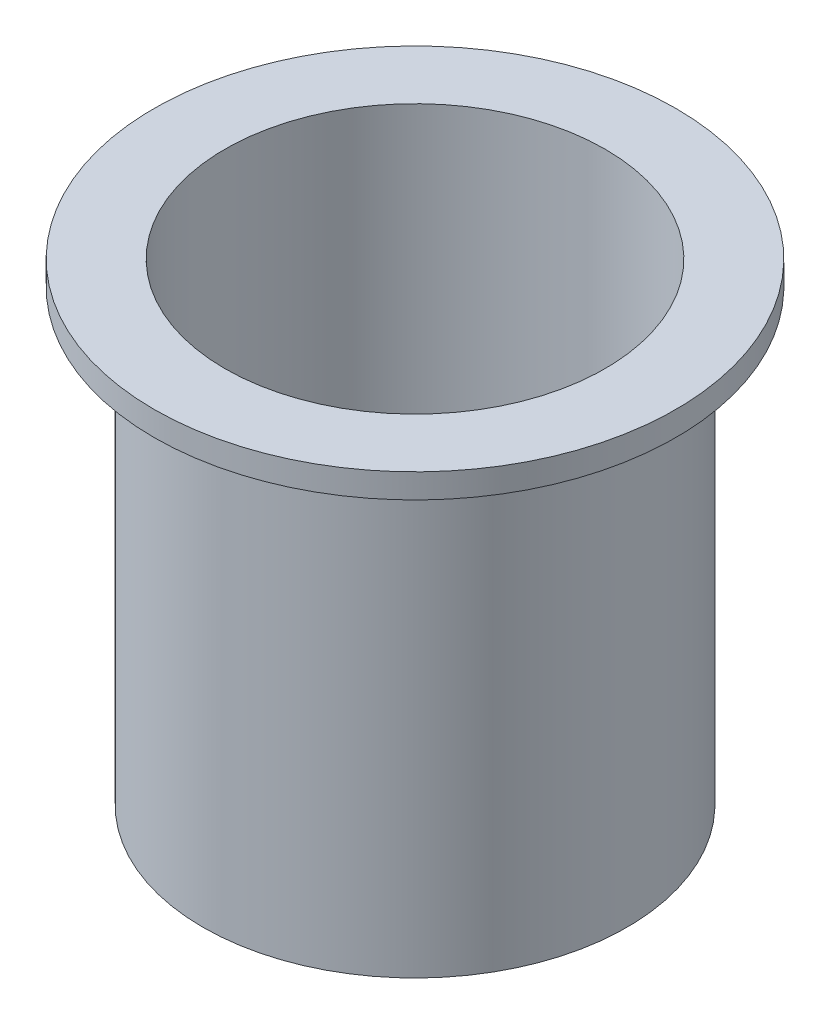
ISO-10303-21;
HEADER;
FILE_DESCRIPTION(('STEP AP214'),'2;1');
FILE_NAME('part.step','',(''),(''),'','','');
FILE_SCHEMA(('AUTOMOTIVE_DESIGN { 1 0 10303 214 1 1 1 1 }'));
ENDSEC;
DATA;
#1=APPLICATION_CONTEXT('core data for automotive mechanical design processes');
#2=APPLICATION_PROTOCOL_DEFINITION('international standard','automotive_design',2000,#1);
#3=PRODUCT_CONTEXT('',#1,'mechanical');
#4=PRODUCT('Part','Part','',(#3));
#5=PRODUCT_RELATED_PRODUCT_CATEGORY('part','',(#4));
#6=PRODUCT_DEFINITION_FORMATION('','',#4);
#7=PRODUCT_DEFINITION_CONTEXT('part definition',#1,'design');
#8=PRODUCT_DEFINITION('design','',#6,#7);
#9=PRODUCT_DEFINITION_SHAPE('','',#8);
#10=(LENGTH_UNIT() NAMED_UNIT(*) SI_UNIT(.MILLI.,.METRE.));
#11=(NAMED_UNIT(*) PLANE_ANGLE_UNIT() SI_UNIT($,.RADIAN.));
#12=(NAMED_UNIT(*) SI_UNIT($,.STERADIAN.) SOLID_ANGLE_UNIT());
#13=UNCERTAINTY_MEASURE_WITH_UNIT(LENGTH_MEASURE(1.E-05),#10,'distance_accuracy_value','');
#14=(GEOMETRIC_REPRESENTATION_CONTEXT(3) GLOBAL_UNCERTAINTY_ASSIGNED_CONTEXT((#13)) GLOBAL_UNIT_ASSIGNED_CONTEXT((#10,
#11,#12)) REPRESENTATION_CONTEXT('',''));
#15=CARTESIAN_POINT('',(0.,0.,0.));
#16=DIRECTION('',(0.,0.,1.));
#17=DIRECTION('',(1.,0.,0.));
#18=AXIS2_PLACEMENT_3D('',#15,#16,#17);
#19=CARTESIAN_POINT('',(0.,95.,0.));
#20=DIRECTION('',(0.,-1.,0.));
#21=DIRECTION('',(0.,0.,-1.));
#22=AXIS2_PLACEMENT_3D('',#19,#20,#21);
#23=CYLINDRICAL_SURFACE('',#22,43.5);
#24=CARTESIAN_POINT('',(0.,95.,0.));
#25=DIRECTION('',(0.,1.,0.));
#26=DIRECTION('',(0.,0.,1.));
#27=AXIS2_PLACEMENT_3D('',#24,#25,#26);
#28=CIRCLE('',#27,43.5);
#29=CARTESIAN_POINT('',(0.,95.,43.5));
#30=VERTEX_POINT('',#29);
#31=EDGE_CURVE('E10',#30,#30,#28,.T.);
#32=ORIENTED_EDGE('',*,*,#31,.F.);
#33=EDGE_LOOP('',(#32));
#34=FACE_BOUND('',#33,.T.);
#35=CARTESIAN_POINT('',(0.,3.,0.));
#36=DIRECTION('',(0.,-1.,0.));
#37=DIRECTION('',(0.,0.,-1.));
#38=AXIS2_PLACEMENT_3D('',#35,#36,#37);
#39=CIRCLE('',#38,43.5);
#40=CARTESIAN_POINT('',(0.,3.,-43.5));
#41=VERTEX_POINT('',#40);
#42=EDGE_CURVE('E59',#41,#41,#39,.T.);
#43=ORIENTED_EDGE('',*,*,#42,.F.);
#44=EDGE_LOOP('',(#43));
#45=FACE_BOUND('',#44,.T.);
#46=ADVANCED_FACE('F36',(#34,#45),#23,.T.);
#47=CARTESIAN_POINT('',(0.,-20.,0.));
#48=DIRECTION('',(0.,1.,0.));
#49=DIRECTION('',(0.,0.,1.));
#50=AXIS2_PLACEMENT_3D('',#47,#48,#49);
#51=CYLINDRICAL_SURFACE('',#50,39.);
#52=CARTESIAN_POINT('',(0.,100.,0.));
#53=DIRECTION('',(0.,1.,0.));
#54=DIRECTION('',(0.,0.,1.));
#55=AXIS2_PLACEMENT_3D('',#52,#53,#54);
#56=CIRCLE('',#55,39.);
#57=CARTESIAN_POINT('',(0.,100.,39.));
#58=VERTEX_POINT('',#57);
#59=EDGE_CURVE('E54',#58,#58,#56,.T.);
#60=CARTESIAN_POINT('',(0.,3.,0.));
#61=DIRECTION('',(0.,-1.,0.));
#62=DIRECTION('',(0.,0.,-1.));
#63=AXIS2_PLACEMENT_3D('',#60,#61,#62);
#64=CIRCLE('',#63,39.);
#65=CARTESIAN_POINT('',(0.,3.,39.));
#66=VERTEX_POINT('',#65);
#67=EDGE_CURVE('E39',#66,#66,#64,.F.);
#68=CARTESIAN_POINT('',(0.,100.,39.));
#69=CARTESIAN_POINT('',(0.,98.9895833333333,39.));
#70=CARTESIAN_POINT('',(0.,97.9791666666667,39.));
#71=CARTESIAN_POINT('',(0.,95.9583333333333,39.));
#72=CARTESIAN_POINT('',(0.,94.9479166666667,39.));
#73=CARTESIAN_POINT('',(0.,92.9270833333333,39.));
#74=CARTESIAN_POINT('',(0.,91.9166666666667,39.));
#75=CARTESIAN_POINT('',(0.,89.8958333333333,39.));
#76=CARTESIAN_POINT('',(0.,88.8854166666667,39.));
#77=CARTESIAN_POINT('',(0.,86.8645833333333,39.));
#78=CARTESIAN_POINT('',(0.,85.8541666666667,39.));
#79=CARTESIAN_POINT('',(0.,83.8333333333333,39.));
#80=CARTESIAN_POINT('',(0.,82.8229166666667,39.));
#81=CARTESIAN_POINT('',(0.,80.8020833333333,39.));
#82=CARTESIAN_POINT('',(0.,79.7916666666667,39.));
#83=CARTESIAN_POINT('',(0.,77.7708333333333,39.));
#84=CARTESIAN_POINT('',(0.,76.7604166666667,39.));
#85=CARTESIAN_POINT('',(0.,74.7395833333333,39.));
#86=CARTESIAN_POINT('',(0.,73.7291666666667,39.));
#87=CARTESIAN_POINT('',(0.,71.7083333333333,39.));
#88=CARTESIAN_POINT('',(0.,70.6979166666667,39.));
#89=CARTESIAN_POINT('',(0.,68.6770833333333,39.));
#90=CARTESIAN_POINT('',(0.,67.6666666666667,39.));
#91=CARTESIAN_POINT('',(0.,65.6458333333333,39.));
#92=CARTESIAN_POINT('',(0.,64.6354166666667,39.));
#93=CARTESIAN_POINT('',(0.,62.6145833333333,39.));
#94=CARTESIAN_POINT('',(0.,61.6041666666667,39.));
#95=CARTESIAN_POINT('',(0.,59.5833333333333,39.));
#96=CARTESIAN_POINT('',(0.,58.5729166666667,39.));
#97=CARTESIAN_POINT('',(0.,56.5520833333333,39.));
#98=CARTESIAN_POINT('',(0.,55.5416666666667,39.));
#99=CARTESIAN_POINT('',(0.,53.5208333333333,39.));
#100=CARTESIAN_POINT('',(0.,52.5104166666667,39.));
#101=CARTESIAN_POINT('',(0.,50.4895833333333,39.));
#102=CARTESIAN_POINT('',(0.,49.4791666666667,39.));
#103=CARTESIAN_POINT('',(0.,47.4583333333333,39.));
#104=CARTESIAN_POINT('',(0.,46.4479166666667,39.));
#105=CARTESIAN_POINT('',(0.,44.4270833333333,39.));
#106=CARTESIAN_POINT('',(0.,43.4166666666667,39.));
#107=CARTESIAN_POINT('',(0.,41.3958333333333,39.));
#108=CARTESIAN_POINT('',(0.,40.3854166666667,39.));
#109=CARTESIAN_POINT('',(0.,38.3645833333333,39.));
#110=CARTESIAN_POINT('',(0.,37.3541666666667,39.));
#111=CARTESIAN_POINT('',(0.,35.3333333333333,39.));
#112=CARTESIAN_POINT('',(0.,34.3229166666667,39.));
#113=CARTESIAN_POINT('',(0.,32.3020833333333,39.));
#114=CARTESIAN_POINT('',(0.,31.2916666666667,39.));
#115=CARTESIAN_POINT('',(0.,29.2708333333333,39.));
#116=CARTESIAN_POINT('',(0.,28.2604166666667,39.));
#117=CARTESIAN_POINT('',(0.,26.2395833333333,39.));
#118=CARTESIAN_POINT('',(0.,25.2291666666667,39.));
#119=CARTESIAN_POINT('',(0.,23.2083333333333,39.));
#120=CARTESIAN_POINT('',(0.,22.1979166666667,39.));
#121=CARTESIAN_POINT('',(0.,20.1770833333333,39.));
#122=CARTESIAN_POINT('',(0.,19.1666666666667,39.));
#123=CARTESIAN_POINT('',(0.,17.1458333333333,39.));
#124=CARTESIAN_POINT('',(0.,16.1354166666667,39.));
#125=CARTESIAN_POINT('',(0.,14.1145833333333,39.));
#126=CARTESIAN_POINT('',(0.,13.1041666666667,39.));
#127=CARTESIAN_POINT('',(0.,11.0833333333333,39.));
#128=CARTESIAN_POINT('',(0.,10.0729166666667,39.));
#129=CARTESIAN_POINT('',(0.,8.05208333333333,39.));
#130=CARTESIAN_POINT('',(0.,7.04166666666667,39.));
#131=CARTESIAN_POINT('',(0.,5.02083333333333,39.));
#132=CARTESIAN_POINT('',(0.,4.01041666666667,39.));
#133=CARTESIAN_POINT('',(0.,3.,39.));
#134=B_SPLINE_CURVE_WITH_KNOTS('',3,(#68,#69,#70,#71,#72,#73,#74,#75,#76,#77,#78,#79,#80,#81,
#82,#83,#84,#85,#86,#87,#88,#89,#90,#91,#92,#93,#94,#95,#96,#97,#98,#99,#100,#101,#102,#103,
#104,#105,#106,#107,#108,#109,#110,#111,#112,#113,#114,#115,#116,#117,#118,#119,#120,#121,#122,
#123,#124,#125,#126,#127,#128,#129,#130,#131,#132,#133),.UNSPECIFIED.,.F.,.F.,(4,2,2,2,2,2,2,2,
2,2,2,2,2,2,2,2,2,2,2,2,2,2,2,2,2,2,2,2,2,2,2,2,4),(0.,3.03125,6.0625,9.09375,12.125,15.15625,
18.1875,21.21875,24.25,27.28125,30.3125,33.34375,36.375,39.40625,42.4375,45.46875,48.5,51.53125,
54.5625,57.59375,60.625,63.65625,66.6875,69.71875,72.75,75.78125,78.8125,81.84375,84.875,
87.90625,90.9375,93.96875,97.),.UNSPECIFIED.);
#135=EDGE_CURVE('BSEAM70',#58,#66,#134,.T.);
#136=ORIENTED_EDGE('',*,*,#59,.T.);
#137=ORIENTED_EDGE('',*,*,#67,.F.);
#138=ORIENTED_EDGE('',*,*,#135,.T.);
#139=ORIENTED_EDGE('',*,*,#135,.F.);
#140=EDGE_LOOP('',(#136,#138,#137,#139));
#141=FACE_BOUND('',#140,.T.);
#142=ADVANCED_FACE('F70',(#141),#51,.F.);
#143=CARTESIAN_POINT('',(0.,100.,0.));
#144=DIRECTION('',(0.,-1.,0.));
#145=DIRECTION('',(0.,0.,-1.));
#146=AXIS2_PLACEMENT_3D('',#143,#144,#145);
#147=CYLINDRICAL_SURFACE('',#146,53.5);
#148=CARTESIAN_POINT('',(0.,100.,0.));
#149=DIRECTION('',(0.,1.,0.));
#150=DIRECTION('',(0.,0.,1.));
#151=AXIS2_PLACEMENT_3D('',#148,#149,#150);
#152=CIRCLE('',#151,53.5);
#153=CARTESIAN_POINT('',(0.,100.,53.5));
#154=VERTEX_POINT('',#153);
#155=EDGE_CURVE('E44',#154,#154,#152,.T.);
#156=ORIENTED_EDGE('',*,*,#155,.F.);
#157=EDGE_LOOP('',(#156));
#158=FACE_BOUND('',#157,.T.);
#159=CARTESIAN_POINT('',(0.,95.,0.));
#160=DIRECTION('',(0.,1.,0.));
#161=DIRECTION('',(0.,0.,1.));
#162=AXIS2_PLACEMENT_3D('',#159,#160,#161);
#163=CIRCLE('',#162,53.5);
#164=CARTESIAN_POINT('',(0.,95.,53.5));
#165=VERTEX_POINT('',#164);
#166=EDGE_CURVE('E49',#165,#165,#163,.T.);
#167=ORIENTED_EDGE('',*,*,#166,.T.);
#168=EDGE_LOOP('',(#167));
#169=FACE_BOUND('',#168,.T.);
#170=ADVANCED_FACE('F72',(#158,#169),#147,.T.);
#171=CARTESIAN_POINT('',(0.,100.,0.));
#172=DIRECTION('',(0.,1.,0.));
#173=DIRECTION('',(0.,0.,1.));
#174=AXIS2_PLACEMENT_3D('',#171,#172,#173);
#175=PLANE('',#174);
#176=ORIENTED_EDGE('',*,*,#59,.F.);
#177=EDGE_LOOP('',(#176));
#178=FACE_BOUND('',#177,.T.);
#179=ORIENTED_EDGE('',*,*,#155,.T.);
#180=EDGE_LOOP('',(#179));
#181=FACE_BOUND('',#180,.T.);
#182=ADVANCED_FACE('F80',(#178,#181),#175,.T.);
#183=CARTESIAN_POINT('',(0.,95.,0.));
#184=DIRECTION('',(0.,1.,0.));
#185=DIRECTION('',(0.,0.,1.));
#186=AXIS2_PLACEMENT_3D('',#183,#184,#185);
#187=PLANE('',#186);
#188=ORIENTED_EDGE('',*,*,#31,.T.);
#189=EDGE_LOOP('',(#188));
#190=FACE_BOUND('',#189,.T.);
#191=ORIENTED_EDGE('',*,*,#166,.F.);
#192=EDGE_LOOP('',(#191));
#193=FACE_BOUND('',#192,.T.);
#194=ADVANCED_FACE('F88',(#190,#193),#187,.F.);
#195=CARTESIAN_POINT('',(0.,3.,0.));
#196=DIRECTION('',(0.,-1.,0.));
#197=DIRECTION('',(0.,0.,-1.));
#198=AXIS2_PLACEMENT_3D('',#195,#196,#197);
#199=PLANE('',#198);
#200=ORIENTED_EDGE('',*,*,#42,.T.);
#201=EDGE_LOOP('',(#200));
#202=FACE_BOUND('',#201,.T.);
#203=ORIENTED_EDGE('',*,*,#67,.T.);
#204=EDGE_LOOP('',(#203));
#205=FACE_BOUND('',#204,.T.);
#206=ADVANCED_FACE('F68',(#202,#205),#199,.T.);
#207=CLOSED_SHELL('',(#46,#142,#170,#182,#194,#206));
#208=MANIFOLD_SOLID_BREP('B2',#207);
#209=ADVANCED_BREP_SHAPE_REPRESENTATION('',(#18,#208),#14);
#210=SHAPE_DEFINITION_REPRESENTATION(#9,#209);
ENDSEC;
END-ISO-10303-21;
